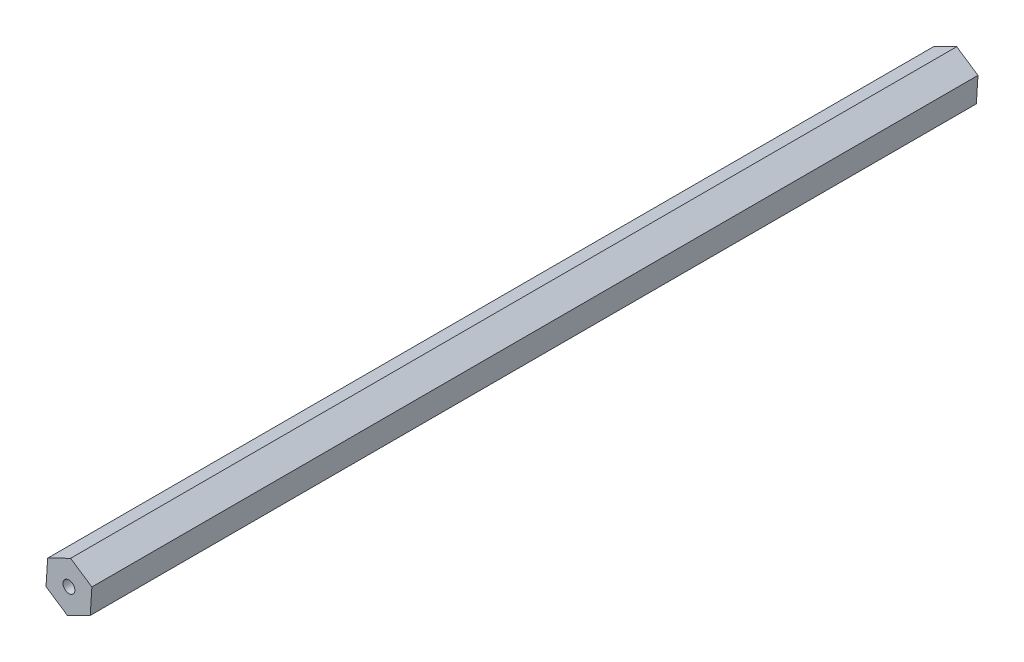
ISO-10303-21;
HEADER;
FILE_DESCRIPTION(('STEP AP214'),'2;1');
FILE_NAME('part.step','',(''),(''),'','','');
FILE_SCHEMA(('AUTOMOTIVE_DESIGN { 1 0 10303 214 1 1 1 1 }'));
ENDSEC;
DATA;
#1=APPLICATION_CONTEXT('core data for automotive mechanical design processes');
#2=APPLICATION_PROTOCOL_DEFINITION('international standard','automotive_design',2000,#1);
#3=PRODUCT_CONTEXT('',#1,'mechanical');
#4=PRODUCT('Part','Part','',(#3));
#5=PRODUCT_RELATED_PRODUCT_CATEGORY('part','',(#4));
#6=PRODUCT_DEFINITION_FORMATION('','',#4);
#7=PRODUCT_DEFINITION_CONTEXT('part definition',#1,'design');
#8=PRODUCT_DEFINITION('design','',#6,#7);
#9=PRODUCT_DEFINITION_SHAPE('','',#8);
#10=(LENGTH_UNIT() NAMED_UNIT(*) SI_UNIT(.MILLI.,.METRE.));
#11=(NAMED_UNIT(*) PLANE_ANGLE_UNIT() SI_UNIT($,.RADIAN.));
#12=(NAMED_UNIT(*) SI_UNIT($,.STERADIAN.) SOLID_ANGLE_UNIT());
#13=UNCERTAINTY_MEASURE_WITH_UNIT(LENGTH_MEASURE(1.E-05),#10,'distance_accuracy_value','');
#14=(GEOMETRIC_REPRESENTATION_CONTEXT(3) GLOBAL_UNCERTAINTY_ASSIGNED_CONTEXT((#13)) GLOBAL_UNIT_ASSIGNED_CONTEXT((#10,
#11,#12)) REPRESENTATION_CONTEXT('',''));
#15=CARTESIAN_POINT('',(0.,0.,0.));
#16=DIRECTION('',(0.,0.,1.));
#17=DIRECTION('',(1.,0.,0.));
#18=AXIS2_PLACEMENT_3D('',#15,#16,#17);
#19=CARTESIAN_POINT('',(0.,0.,300.));
#20=DIRECTION('',(0.,0.,1.));
#21=DIRECTION('',(1.,0.,0.));
#22=AXIS2_PLACEMENT_3D('',#19,#20,#21);
#23=PLANE('',#22);
#24=DIRECTION('',(0.896684522221995,0.442670156671434,0.));
#25=VECTOR('',#24,1.);
#26=CARTESIAN_POINT('',(-0.56273170208704,-8.64195192253844,300.));
#27=LINE('',#26,#25);
#28=CARTESIAN_POINT('',(-0.56273170208704,-8.64195192253844,300.));
#29=VERTEX_POINT('',#28);
#30=CARTESIAN_POINT('',(7.20278405215853,-4.80831591079146,300.));
#31=VERTEX_POINT('',#30);
#32=EDGE_CURVE('E137',#29,#31,#27,.T.);
#33=ORIENTED_EDGE('',*,*,#32,.T.);
#34=DIRECTION('',(0.0649786599362985,0.997886653760277,0.));
#35=VECTOR('',#34,1.);
#36=CARTESIAN_POINT('',(7.20278405215853,-4.80831591079146,300.));
#37=LINE('',#36,#35);
#38=CARTESIAN_POINT('',(7.76551575424558,3.83363601174698,300.));
#39=VERTEX_POINT('',#38);
#40=EDGE_CURVE('E95',#31,#39,#37,.T.);
#41=ORIENTED_EDGE('',*,*,#40,.T.);
#42=DIRECTION('',(-0.831705862285697,0.555216497088843,0.));
#43=VECTOR('',#42,1.);
#44=CARTESIAN_POINT('',(7.76551575424558,3.83363601174698,300.));
#45=LINE('',#44,#43);
#46=CARTESIAN_POINT('',(0.562731702087048,8.64195192253844,300.));
#47=VERTEX_POINT('',#46);
#48=EDGE_CURVE('E108',#39,#47,#45,.T.);
#49=ORIENTED_EDGE('',*,*,#48,.T.);
#50=DIRECTION('',(-0.896684522221995,-0.442670156671434,0.));
#51=VECTOR('',#50,1.);
#52=CARTESIAN_POINT('',(0.562731702087048,8.64195192253844,300.));
#53=LINE('',#52,#51);
#54=CARTESIAN_POINT('',(-7.20278405215853,4.80831591079146,300.));
#55=VERTEX_POINT('',#54);
#56=EDGE_CURVE('E102',#47,#55,#53,.T.);
#57=ORIENTED_EDGE('',*,*,#56,.T.);
#58=DIRECTION('',(-0.0649786599362984,-0.997886653760277,0.));
#59=VECTOR('',#58,1.);
#60=CARTESIAN_POINT('',(-7.20278405215853,4.80831591079146,300.));
#61=LINE('',#60,#59);
#62=CARTESIAN_POINT('',(-7.76551575424558,-3.83363601174698,300.));
#63=VERTEX_POINT('',#62);
#64=EDGE_CURVE('E106',#55,#63,#61,.T.);
#65=ORIENTED_EDGE('',*,*,#64,.T.);
#66=DIRECTION('',(0.831705862285697,-0.555216497088843,0.));
#67=VECTOR('',#66,1.);
#68=CARTESIAN_POINT('',(-7.76551575424558,-3.83363601174698,300.));
#69=LINE('',#68,#67);
#70=EDGE_CURVE('E58',#63,#29,#69,.T.);
#71=ORIENTED_EDGE('',*,*,#70,.T.);
#72=EDGE_LOOP('',(#33,#41,#49,#57,#65,#71));
#73=FACE_BOUND('',#72,.T.);
#74=CARTESIAN_POINT('',(0.,0.,300.));
#75=DIRECTION('',(0.,0.,1.));
#76=DIRECTION('',(1.,0.,0.));
#77=AXIS2_PLACEMENT_3D('',#74,#75,#76);
#78=CIRCLE('',#77,2.);
#79=CARTESIAN_POINT('',(2.,0.,300.));
#80=VERTEX_POINT('',#79);
#81=EDGE_CURVE('E130',#80,#80,#78,.T.);
#82=ORIENTED_EDGE('',*,*,#81,.F.);
#83=EDGE_LOOP('',(#82));
#84=FACE_BOUND('',#83,.T.);
#85=ADVANCED_FACE('F41',(#73,#84),#23,.T.);
#86=CARTESIAN_POINT('',(0.,0.,0.));
#87=DIRECTION('',(0.,0.,1.));
#88=DIRECTION('',(1.,0.,0.));
#89=AXIS2_PLACEMENT_3D('',#86,#87,#88);
#90=PLANE('',#89);
#91=DIRECTION('',(0.896684522221995,0.442670156671434,0.));
#92=VECTOR('',#91,1.);
#93=CARTESIAN_POINT('',(-0.56273170208704,-8.64195192253844,0.));
#94=LINE('',#93,#92);
#95=CARTESIAN_POINT('',(-0.56273170208704,-8.64195192253844,0.));
#96=VERTEX_POINT('',#95);
#97=CARTESIAN_POINT('',(7.20278405215853,-4.80831591079146,0.));
#98=VERTEX_POINT('',#97);
#99=EDGE_CURVE('E126',#96,#98,#94,.T.);
#100=ORIENTED_EDGE('',*,*,#99,.F.);
#101=DIRECTION('',(0.831705862285697,-0.555216497088843,0.));
#102=VECTOR('',#101,1.);
#103=CARTESIAN_POINT('',(-7.76551575424558,-3.83363601174698,0.));
#104=LINE('',#103,#102);
#105=CARTESIAN_POINT('',(-7.76551575424558,-3.83363601174698,0.));
#106=VERTEX_POINT('',#105);
#107=EDGE_CURVE('E87',#106,#96,#104,.T.);
#108=ORIENTED_EDGE('',*,*,#107,.F.);
#109=DIRECTION('',(-0.0649786599362984,-0.997886653760277,0.));
#110=VECTOR('',#109,1.);
#111=CARTESIAN_POINT('',(-7.20278405215853,4.80831591079146,0.));
#112=LINE('',#111,#110);
#113=CARTESIAN_POINT('',(-7.20278405215853,4.80831591079146,0.));
#114=VERTEX_POINT('',#113);
#115=EDGE_CURVE('E81',#114,#106,#112,.T.);
#116=ORIENTED_EDGE('',*,*,#115,.F.);
#117=DIRECTION('',(-0.896684522221995,-0.442670156671434,0.));
#118=VECTOR('',#117,1.);
#119=CARTESIAN_POINT('',(0.562731702087048,8.64195192253844,0.));
#120=LINE('',#119,#118);
#121=CARTESIAN_POINT('',(0.562731702087048,8.64195192253844,0.));
#122=VERTEX_POINT('',#121);
#123=EDGE_CURVE('E116',#122,#114,#120,.T.);
#124=ORIENTED_EDGE('',*,*,#123,.F.);
#125=DIRECTION('',(-0.831705862285697,0.555216497088843,0.));
#126=VECTOR('',#125,1.);
#127=CARTESIAN_POINT('',(7.76551575424558,3.83363601174698,0.));
#128=LINE('',#127,#126);
#129=CARTESIAN_POINT('',(7.76551575424558,3.83363601174698,0.));
#130=VERTEX_POINT('',#129);
#131=EDGE_CURVE('E132',#130,#122,#128,.T.);
#132=ORIENTED_EDGE('',*,*,#131,.F.);
#133=DIRECTION('',(0.0649786599362985,0.997886653760277,0.));
#134=VECTOR('',#133,1.);
#135=CARTESIAN_POINT('',(7.20278405215853,-4.80831591079146,0.));
#136=LINE('',#135,#134);
#137=EDGE_CURVE('E129',#98,#130,#136,.T.);
#138=ORIENTED_EDGE('',*,*,#137,.F.);
#139=EDGE_LOOP('',(#100,#108,#116,#124,#132,#138));
#140=FACE_BOUND('',#139,.T.);
#141=CARTESIAN_POINT('',(0.,0.,0.));
#142=DIRECTION('',(0.,0.,1.));
#143=DIRECTION('',(1.,0.,0.));
#144=AXIS2_PLACEMENT_3D('',#141,#142,#143);
#145=CIRCLE('',#144,2.);
#146=CARTESIAN_POINT('',(2.,0.,0.));
#147=VERTEX_POINT('',#146);
#148=EDGE_CURVE('E234',#147,#147,#145,.T.);
#149=ORIENTED_EDGE('',*,*,#148,.T.);
#150=EDGE_LOOP('',(#149));
#151=FACE_BOUND('',#150,.T.);
#152=ADVANCED_FACE('F146',(#140,#151),#90,.F.);
#153=CARTESIAN_POINT('',(-0.56273170208704,-8.64195192253844,300.));
#154=DIRECTION('',(-0.442670156671434,0.896684522221995,0.));
#155=DIRECTION('',(-0.896684522221995,-0.442670156671434,0.));
#156=AXIS2_PLACEMENT_3D('',#153,#154,#155);
#157=PLANE('',#156);
#158=ORIENTED_EDGE('',*,*,#99,.T.);
#159=DIRECTION('',(0.,0.,-1.));
#160=VECTOR('',#159,1.);
#161=CARTESIAN_POINT('',(7.20278405215853,-4.80831591079146,300.));
#162=LINE('',#161,#160);
#163=EDGE_CURVE('E11',#31,#98,#162,.T.);
#164=ORIENTED_EDGE('',*,*,#163,.F.);
#165=ORIENTED_EDGE('',*,*,#32,.F.);
#166=DIRECTION('',(0.,0.,-1.));
#167=VECTOR('',#166,1.);
#168=CARTESIAN_POINT('',(-0.56273170208704,-8.64195192253844,300.));
#169=LINE('',#168,#167);
#170=EDGE_CURVE('E122',#29,#96,#169,.T.);
#171=ORIENTED_EDGE('',*,*,#170,.T.);
#172=EDGE_LOOP('',(#158,#164,#165,#171));
#173=FACE_BOUND('',#172,.T.);
#174=ADVANCED_FACE('F43',(#173),#157,.F.);
#175=CARTESIAN_POINT('',(7.20278405215853,-4.80831591079146,300.));
#176=DIRECTION('',(-0.997886653760277,0.0649786599362985,0.));
#177=DIRECTION('',(-0.0649786599362985,-0.997886653760277,0.));
#178=AXIS2_PLACEMENT_3D('',#175,#176,#177);
#179=PLANE('',#178);
#180=ORIENTED_EDGE('',*,*,#137,.T.);
#181=DIRECTION('',(0.,0.,-1.));
#182=VECTOR('',#181,1.);
#183=CARTESIAN_POINT('',(7.76551575424558,3.83363601174698,300.));
#184=LINE('',#183,#182);
#185=EDGE_CURVE('E50',#39,#130,#184,.T.);
#186=ORIENTED_EDGE('',*,*,#185,.F.);
#187=ORIENTED_EDGE('',*,*,#40,.F.);
#188=ORIENTED_EDGE('',*,*,#163,.T.);
#189=EDGE_LOOP('',(#180,#186,#187,#188));
#190=FACE_BOUND('',#189,.T.);
#191=ADVANCED_FACE('F171',(#190),#179,.F.);
#192=CARTESIAN_POINT('',(7.76551575424558,3.83363601174698,300.));
#193=DIRECTION('',(-0.555216497088843,-0.831705862285697,0.));
#194=DIRECTION('',(0.831705862285697,-0.555216497088843,0.));
#195=AXIS2_PLACEMENT_3D('',#192,#193,#194);
#196=PLANE('',#195);
#197=ORIENTED_EDGE('',*,*,#131,.T.);
#198=DIRECTION('',(0.,0.,-1.));
#199=VECTOR('',#198,1.);
#200=CARTESIAN_POINT('',(0.562731702087048,8.64195192253844,300.));
#201=LINE('',#200,#199);
#202=EDGE_CURVE('E117',#47,#122,#201,.T.);
#203=ORIENTED_EDGE('',*,*,#202,.F.);
#204=ORIENTED_EDGE('',*,*,#48,.F.);
#205=ORIENTED_EDGE('',*,*,#185,.T.);
#206=EDGE_LOOP('',(#197,#203,#204,#205));
#207=FACE_BOUND('',#206,.T.);
#208=ADVANCED_FACE('F143',(#207),#196,.F.);
#209=CARTESIAN_POINT('',(0.562731702087048,8.64195192253844,300.));
#210=DIRECTION('',(0.442670156671434,-0.896684522221995,0.));
#211=DIRECTION('',(0.896684522221996,0.442670156671434,0.));
#212=AXIS2_PLACEMENT_3D('',#209,#210,#211);
#213=PLANE('',#212);
#214=ORIENTED_EDGE('',*,*,#123,.T.);
#215=DIRECTION('',(0.,0.,-1.));
#216=VECTOR('',#215,1.);
#217=CARTESIAN_POINT('',(-7.20278405215853,4.80831591079146,300.));
#218=LINE('',#217,#216);
#219=EDGE_CURVE('E113',#55,#114,#218,.T.);
#220=ORIENTED_EDGE('',*,*,#219,.F.);
#221=ORIENTED_EDGE('',*,*,#56,.F.);
#222=ORIENTED_EDGE('',*,*,#202,.T.);
#223=EDGE_LOOP('',(#214,#220,#221,#222));
#224=FACE_BOUND('',#223,.T.);
#225=ADVANCED_FACE('F114',(#224),#213,.F.);
#226=CARTESIAN_POINT('',(-7.20278405215853,4.80831591079146,300.));
#227=DIRECTION('',(0.997886653760277,-0.0649786599362984,0.));
#228=DIRECTION('',(0.0649786599362984,0.997886653760277,0.));
#229=AXIS2_PLACEMENT_3D('',#226,#227,#228);
#230=PLANE('',#229);
#231=ORIENTED_EDGE('',*,*,#115,.T.);
#232=DIRECTION('',(0.,0.,-1.));
#233=VECTOR('',#232,1.);
#234=CARTESIAN_POINT('',(-7.76551575424558,-3.83363601174698,300.));
#235=LINE('',#234,#233);
#236=EDGE_CURVE('E118',#63,#106,#235,.T.);
#237=ORIENTED_EDGE('',*,*,#236,.F.);
#238=ORIENTED_EDGE('',*,*,#64,.F.);
#239=ORIENTED_EDGE('',*,*,#219,.T.);
#240=EDGE_LOOP('',(#231,#237,#238,#239));
#241=FACE_BOUND('',#240,.T.);
#242=ADVANCED_FACE('F120',(#241),#230,.F.);
#243=CARTESIAN_POINT('',(-7.76551575424558,-3.83363601174698,300.));
#244=DIRECTION('',(0.555216497088843,0.831705862285697,0.));
#245=DIRECTION('',(-0.831705862285697,0.555216497088843,0.));
#246=AXIS2_PLACEMENT_3D('',#243,#244,#245);
#247=PLANE('',#246);
#248=ORIENTED_EDGE('',*,*,#107,.T.);
#249=ORIENTED_EDGE('',*,*,#170,.F.);
#250=ORIENTED_EDGE('',*,*,#70,.F.);
#251=ORIENTED_EDGE('',*,*,#236,.T.);
#252=EDGE_LOOP('',(#248,#249,#250,#251));
#253=FACE_BOUND('',#252,.T.);
#254=ADVANCED_FACE('F151',(#253),#247,.F.);
#255=CARTESIAN_POINT('',(0.,0.,300.));
#256=DIRECTION('',(0.,0.,-1.));
#257=DIRECTION('',(-1.,0.,0.));
#258=AXIS2_PLACEMENT_3D('',#255,#256,#257);
#259=CYLINDRICAL_SURFACE('',#258,2.);
#260=ORIENTED_EDGE('',*,*,#81,.T.);
#261=EDGE_LOOP('',(#260));
#262=FACE_BOUND('',#261,.T.);
#263=ORIENTED_EDGE('',*,*,#148,.F.);
#264=EDGE_LOOP('',(#263));
#265=FACE_BOUND('',#264,.T.);
#266=ADVANCED_FACE('F153',(#262,#265),#259,.F.);
#267=CLOSED_SHELL('',(#85,#152,#174,#191,#208,#225,#242,#254,#266));
#268=MANIFOLD_SOLID_BREP('B2',#267);
#269=ADVANCED_BREP_SHAPE_REPRESENTATION('',(#18,#268),#14);
#270=SHAPE_DEFINITION_REPRESENTATION(#9,#269);
ENDSEC;
END-ISO-10303-21;
